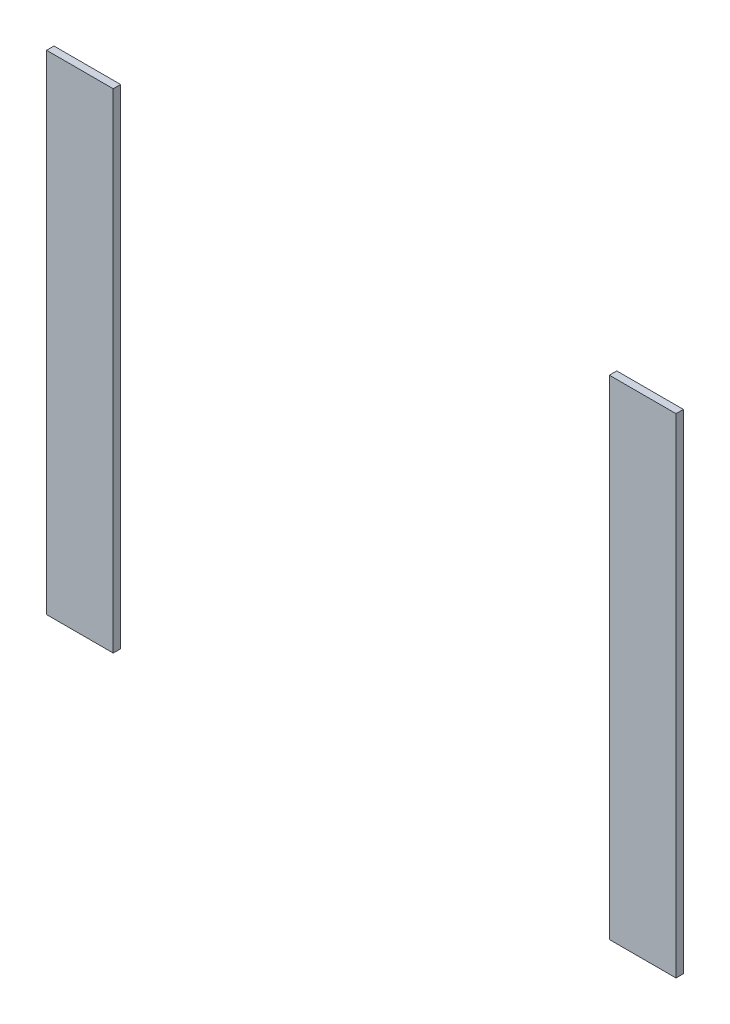
ISO-10303-21;
HEADER;
FILE_DESCRIPTION(('STEP AP214'),'2;1');
FILE_NAME('part.step','',(''),(''),'','','');
FILE_SCHEMA(('AUTOMOTIVE_DESIGN { 1 0 10303 214 1 1 1 1 }'));
ENDSEC;
DATA;
#1=APPLICATION_CONTEXT('core data for automotive mechanical design processes');
#2=APPLICATION_PROTOCOL_DEFINITION('international standard','automotive_design',2000,#1);
#3=PRODUCT_CONTEXT('',#1,'mechanical');
#4=PRODUCT('Part','Part','',(#3));
#5=PRODUCT_RELATED_PRODUCT_CATEGORY('part','',(#4));
#6=PRODUCT_DEFINITION_FORMATION('','',#4);
#7=PRODUCT_DEFINITION_CONTEXT('part definition',#1,'design');
#8=PRODUCT_DEFINITION('design','',#6,#7);
#9=PRODUCT_DEFINITION_SHAPE('','',#8);
#10=(LENGTH_UNIT() NAMED_UNIT(*) SI_UNIT(.MILLI.,.METRE.));
#11=(NAMED_UNIT(*) PLANE_ANGLE_UNIT() SI_UNIT($,.RADIAN.));
#12=(NAMED_UNIT(*) SI_UNIT($,.STERADIAN.) SOLID_ANGLE_UNIT());
#13=UNCERTAINTY_MEASURE_WITH_UNIT(LENGTH_MEASURE(1.E-05),#10,'distance_accuracy_value','');
#14=(GEOMETRIC_REPRESENTATION_CONTEXT(3) GLOBAL_UNCERTAINTY_ASSIGNED_CONTEXT((#13)) GLOBAL_UNIT_ASSIGNED_CONTEXT((#10,
#11,#12)) REPRESENTATION_CONTEXT('',''));
#15=CARTESIAN_POINT('',(0.,0.,0.));
#16=DIRECTION('',(0.,0.,1.));
#17=DIRECTION('',(1.,0.,0.));
#18=AXIS2_PLACEMENT_3D('',#15,#16,#17);
#19=CARTESIAN_POINT('',(335.000000000001,0.,10.));
#20=DIRECTION('',(-1.,0.,0.));
#21=DIRECTION('',(0.,0.,1.));
#22=AXIS2_PLACEMENT_3D('',#19,#20,#21);
#23=PLANE('',#22);
#24=DIRECTION('',(0.,1.,0.));
#25=VECTOR('',#24,1.);
#26=CARTESIAN_POINT('',(335.000000000001,0.,0.));
#27=LINE('',#26,#25);
#28=CARTESIAN_POINT('',(335.000000000001,-45.,0.));
#29=VERTEX_POINT('',#28);
#30=CARTESIAN_POINT('',(335.000000000001,615.,0.));
#31=VERTEX_POINT('',#30);
#32=EDGE_CURVE('E109',#29,#31,#27,.T.);
#33=ORIENTED_EDGE('',*,*,#32,.F.);
#34=DIRECTION('',(0.,0.,-1.));
#35=VECTOR('',#34,1.);
#36=CARTESIAN_POINT('',(335.000000000001,-45.,10.));
#37=LINE('',#36,#35);
#38=CARTESIAN_POINT('',(335.000000000001,-45.,10.));
#39=VERTEX_POINT('',#38);
#40=EDGE_CURVE('E12',#39,#29,#37,.T.);
#41=ORIENTED_EDGE('',*,*,#40,.F.);
#42=DIRECTION('',(0.,1.,0.));
#43=VECTOR('',#42,1.);
#44=CARTESIAN_POINT('',(335.000000000001,0.,10.));
#45=LINE('',#44,#43);
#46=CARTESIAN_POINT('',(335.000000000001,615.,10.));
#47=VERTEX_POINT('',#46);
#48=EDGE_CURVE('E103',#39,#47,#45,.T.);
#49=ORIENTED_EDGE('',*,*,#48,.T.);
#50=DIRECTION('',(0.,0.,-1.));
#51=VECTOR('',#50,1.);
#52=CARTESIAN_POINT('',(335.000000000001,615.,10.));
#53=LINE('',#52,#51);
#54=EDGE_CURVE('E61',#47,#31,#53,.T.);
#55=ORIENTED_EDGE('',*,*,#54,.T.);
#56=EDGE_LOOP('',(#33,#41,#49,#55));
#57=FACE_BOUND('',#56,.T.);
#58=ADVANCED_FACE('F45',(#57),#23,.T.);
#59=CARTESIAN_POINT('',(0.,-45.0000000000001,10.));
#60=DIRECTION('',(0.,-1.,0.));
#61=DIRECTION('',(1.,0.,0.));
#62=AXIS2_PLACEMENT_3D('',#59,#60,#61);
#63=PLANE('',#62);
#64=DIRECTION('',(-1.,0.,0.));
#65=VECTOR('',#64,1.);
#66=CARTESIAN_POINT('',(0.,-45.0000000000001,0.));
#67=LINE('',#66,#65);
#68=CARTESIAN_POINT('',(425.000000000001,-45.,0.));
#69=VERTEX_POINT('',#68);
#70=EDGE_CURVE('E93',#69,#29,#67,.T.);
#71=ORIENTED_EDGE('',*,*,#70,.F.);
#72=DIRECTION('',(0.,0.,-1.));
#73=VECTOR('',#72,1.);
#74=CARTESIAN_POINT('',(425.000000000001,-45.,10.));
#75=LINE('',#74,#73);
#76=CARTESIAN_POINT('',(425.000000000001,-45.,10.));
#77=VERTEX_POINT('',#76);
#78=EDGE_CURVE('E53',#77,#69,#75,.T.);
#79=ORIENTED_EDGE('',*,*,#78,.F.);
#80=DIRECTION('',(-1.,0.,0.));
#81=VECTOR('',#80,1.);
#82=CARTESIAN_POINT('',(0.,-45.0000000000001,10.));
#83=LINE('',#82,#81);
#84=EDGE_CURVE('E91',#77,#39,#83,.T.);
#85=ORIENTED_EDGE('',*,*,#84,.T.);
#86=ORIENTED_EDGE('',*,*,#40,.T.);
#87=EDGE_LOOP('',(#71,#79,#85,#86));
#88=FACE_BOUND('',#87,.T.);
#89=ADVANCED_FACE('F89',(#88),#63,.T.);
#90=CARTESIAN_POINT('',(425.000000000001,0.,10.));
#91=DIRECTION('',(-1.,0.,0.));
#92=DIRECTION('',(0.,0.,1.));
#93=AXIS2_PLACEMENT_3D('',#90,#91,#92);
#94=PLANE('',#93);
#95=DIRECTION('',(0.,1.,0.));
#96=VECTOR('',#95,1.);
#97=CARTESIAN_POINT('',(425.000000000001,0.,0.));
#98=LINE('',#97,#96);
#99=CARTESIAN_POINT('',(425.000000000001,615.,0.));
#100=VERTEX_POINT('',#99);
#101=EDGE_CURVE('E112',#69,#100,#98,.T.);
#102=ORIENTED_EDGE('',*,*,#101,.T.);
#103=DIRECTION('',(0.,0.,-1.));
#104=VECTOR('',#103,1.);
#105=CARTESIAN_POINT('',(425.000000000001,615.,10.));
#106=LINE('',#105,#104);
#107=CARTESIAN_POINT('',(425.000000000001,615.,10.));
#108=VERTEX_POINT('',#107);
#109=EDGE_CURVE('E75',#108,#100,#106,.T.);
#110=ORIENTED_EDGE('',*,*,#109,.F.);
#111=DIRECTION('',(0.,1.,0.));
#112=VECTOR('',#111,1.);
#113=CARTESIAN_POINT('',(425.000000000001,0.,10.));
#114=LINE('',#113,#112);
#115=EDGE_CURVE('E96',#77,#108,#114,.T.);
#116=ORIENTED_EDGE('',*,*,#115,.F.);
#117=ORIENTED_EDGE('',*,*,#78,.T.);
#118=EDGE_LOOP('',(#102,#110,#116,#117));
#119=FACE_BOUND('',#118,.T.);
#120=ADVANCED_FACE('F97',(#119),#94,.F.);
#121=CARTESIAN_POINT('',(0.,615.,10.));
#122=DIRECTION('',(0.,1.,0.));
#123=DIRECTION('',(0.,0.,1.));
#124=AXIS2_PLACEMENT_3D('',#121,#122,#123);
#125=PLANE('',#124);
#126=DIRECTION('',(1.,0.,0.));
#127=VECTOR('',#126,1.);
#128=CARTESIAN_POINT('',(0.,615.,0.));
#129=LINE('',#128,#127);
#130=EDGE_CURVE('E105',#31,#100,#129,.T.);
#131=ORIENTED_EDGE('',*,*,#130,.F.);
#132=ORIENTED_EDGE('',*,*,#54,.F.);
#133=DIRECTION('',(1.,0.,0.));
#134=VECTOR('',#133,1.);
#135=CARTESIAN_POINT('',(0.,615.,10.));
#136=LINE('',#135,#134);
#137=EDGE_CURVE('E100',#47,#108,#136,.T.);
#138=ORIENTED_EDGE('',*,*,#137,.T.);
#139=ORIENTED_EDGE('',*,*,#109,.T.);
#140=EDGE_LOOP('',(#131,#132,#138,#139));
#141=FACE_BOUND('',#140,.T.);
#142=ADVANCED_FACE('F119',(#141),#125,.T.);
#143=CARTESIAN_POINT('',(0.,0.,10.));
#144=DIRECTION('',(0.,0.,1.));
#145=DIRECTION('',(1.,0.,0.));
#146=AXIS2_PLACEMENT_3D('',#143,#144,#145);
#147=PLANE('',#146);
#148=ORIENTED_EDGE('',*,*,#48,.F.);
#149=ORIENTED_EDGE('',*,*,#84,.F.);
#150=ORIENTED_EDGE('',*,*,#115,.T.);
#151=ORIENTED_EDGE('',*,*,#137,.F.);
#152=EDGE_LOOP('',(#148,#149,#150,#151));
#153=FACE_BOUND('',#152,.T.);
#154=ADVANCED_FACE('F102',(#153),#147,.T.);
#155=CARTESIAN_POINT('',(0.,0.,0.));
#156=DIRECTION('',(0.,0.,1.));
#157=DIRECTION('',(1.,0.,0.));
#158=AXIS2_PLACEMENT_3D('',#155,#156,#157);
#159=PLANE('',#158);
#160=ORIENTED_EDGE('',*,*,#32,.T.);
#161=ORIENTED_EDGE('',*,*,#130,.T.);
#162=ORIENTED_EDGE('',*,*,#101,.F.);
#163=ORIENTED_EDGE('',*,*,#70,.T.);
#164=EDGE_LOOP('',(#160,#161,#162,#163));
#165=FACE_BOUND('',#164,.T.);
#166=ADVANCED_FACE('F118',(#165),#159,.F.);
#167=CLOSED_SHELL('',(#58,#89,#120,#142,#154,#166));
#168=MANIFOLD_SOLID_BREP('B2',#167);
#169=CARTESIAN_POINT('',(0.,-45.,10.));
#170=DIRECTION('',(0.,1.,0.));
#171=DIRECTION('',(0.,0.,1.));
#172=AXIS2_PLACEMENT_3D('',#169,#170,#171);
#173=PLANE('',#172);
#174=DIRECTION('',(1.,0.,0.));
#175=VECTOR('',#174,1.);
#176=CARTESIAN_POINT('',(0.,-45.,0.));
#177=LINE('',#176,#175);
#178=CARTESIAN_POINT('',(-424.999999999999,-45.,0.));
#179=VERTEX_POINT('',#178);
#180=CARTESIAN_POINT('',(-334.999999999999,-45.,0.));
#181=VERTEX_POINT('',#180);
#182=EDGE_CURVE('E235',#179,#181,#177,.T.);
#183=ORIENTED_EDGE('',*,*,#182,.T.);
#184=DIRECTION('',(0.,0.,-1.));
#185=VECTOR('',#184,1.);
#186=CARTESIAN_POINT('',(-334.999999999999,-45.,10.));
#187=LINE('',#186,#185);
#188=CARTESIAN_POINT('',(-334.999999999999,-45.,10.));
#189=VERTEX_POINT('',#188);
#190=EDGE_CURVE('E43',#189,#181,#187,.T.);
#191=ORIENTED_EDGE('',*,*,#190,.F.);
#192=DIRECTION('',(1.,0.,0.));
#193=VECTOR('',#192,1.);
#194=CARTESIAN_POINT('',(0.,-45.,10.));
#195=LINE('',#194,#193);
#196=CARTESIAN_POINT('',(-424.999999999999,-45.,10.));
#197=VERTEX_POINT('',#196);
#198=EDGE_CURVE('E221',#197,#189,#195,.T.);
#199=ORIENTED_EDGE('',*,*,#198,.F.);
#200=DIRECTION('',(0.,0.,-1.));
#201=VECTOR('',#200,1.);
#202=CARTESIAN_POINT('',(-424.999999999999,-45.,10.));
#203=LINE('',#202,#201);
#204=EDGE_CURVE('E188',#197,#179,#203,.T.);
#205=ORIENTED_EDGE('',*,*,#204,.T.);
#206=EDGE_LOOP('',(#183,#191,#199,#205));
#207=FACE_BOUND('',#206,.T.);
#208=ADVANCED_FACE('F172',(#207),#173,.F.);
#209=CARTESIAN_POINT('',(-334.999999999999,0.,10.));
#210=DIRECTION('',(-1.,0.,0.));
#211=DIRECTION('',(0.,0.,1.));
#212=AXIS2_PLACEMENT_3D('',#209,#210,#211);
#213=PLANE('',#212);
#214=DIRECTION('',(0.,1.,0.));
#215=VECTOR('',#214,1.);
#216=CARTESIAN_POINT('',(-334.999999999999,0.,0.));
#217=LINE('',#216,#215);
#218=CARTESIAN_POINT('',(-334.999999999999,615.,0.));
#219=VERTEX_POINT('',#218);
#220=EDGE_CURVE('E226',#181,#219,#217,.T.);
#221=ORIENTED_EDGE('',*,*,#220,.T.);
#222=DIRECTION('',(0.,0.,-1.));
#223=VECTOR('',#222,1.);
#224=CARTESIAN_POINT('',(-334.999999999999,615.,10.));
#225=LINE('',#224,#223);
#226=CARTESIAN_POINT('',(-334.999999999999,615.,10.));
#227=VERTEX_POINT('',#226);
#228=EDGE_CURVE('E180',#227,#219,#225,.T.);
#229=ORIENTED_EDGE('',*,*,#228,.F.);
#230=DIRECTION('',(0.,1.,0.));
#231=VECTOR('',#230,1.);
#232=CARTESIAN_POINT('',(-334.999999999999,0.,10.));
#233=LINE('',#232,#231);
#234=EDGE_CURVE('E213',#189,#227,#233,.T.);
#235=ORIENTED_EDGE('',*,*,#234,.F.);
#236=ORIENTED_EDGE('',*,*,#190,.T.);
#237=EDGE_LOOP('',(#221,#229,#235,#236));
#238=FACE_BOUND('',#237,.T.);
#239=ADVANCED_FACE('F225',(#238),#213,.F.);
#240=CARTESIAN_POINT('',(0.,615.,10.));
#241=DIRECTION('',(0.,1.,0.));
#242=DIRECTION('',(0.,0.,1.));
#243=AXIS2_PLACEMENT_3D('',#240,#241,#242);
#244=PLANE('',#243);
#245=DIRECTION('',(1.,0.,0.));
#246=VECTOR('',#245,1.);
#247=CARTESIAN_POINT('',(0.,615.,0.));
#248=LINE('',#247,#246);
#249=CARTESIAN_POINT('',(-424.999999999999,615.,0.));
#250=VERTEX_POINT('',#249);
#251=EDGE_CURVE('E238',#250,#219,#248,.T.);
#252=ORIENTED_EDGE('',*,*,#251,.F.);
#253=DIRECTION('',(0.,0.,-1.));
#254=VECTOR('',#253,1.);
#255=CARTESIAN_POINT('',(-424.999999999999,615.,10.));
#256=LINE('',#255,#254);
#257=CARTESIAN_POINT('',(-424.999999999999,615.,10.));
#258=VERTEX_POINT('',#257);
#259=EDGE_CURVE('E202',#258,#250,#256,.T.);
#260=ORIENTED_EDGE('',*,*,#259,.F.);
#261=DIRECTION('',(1.,0.,0.));
#262=VECTOR('',#261,1.);
#263=CARTESIAN_POINT('',(0.,615.,10.));
#264=LINE('',#263,#262);
#265=EDGE_CURVE('E220',#258,#227,#264,.T.);
#266=ORIENTED_EDGE('',*,*,#265,.T.);
#267=ORIENTED_EDGE('',*,*,#228,.T.);
#268=EDGE_LOOP('',(#252,#260,#266,#267));
#269=FACE_BOUND('',#268,.T.);
#270=ADVANCED_FACE('F229',(#269),#244,.T.);
#271=CARTESIAN_POINT('',(-424.999999999999,0.,10.));
#272=DIRECTION('',(-1.,0.,0.));
#273=DIRECTION('',(0.,0.,1.));
#274=AXIS2_PLACEMENT_3D('',#271,#272,#273);
#275=PLANE('',#274);
#276=DIRECTION('',(0.,1.,0.));
#277=VECTOR('',#276,1.);
#278=CARTESIAN_POINT('',(-424.999999999999,0.,0.));
#279=LINE('',#278,#277);
#280=EDGE_CURVE('E240',#179,#250,#279,.T.);
#281=ORIENTED_EDGE('',*,*,#280,.F.);
#282=ORIENTED_EDGE('',*,*,#204,.F.);
#283=DIRECTION('',(0.,1.,0.));
#284=VECTOR('',#283,1.);
#285=CARTESIAN_POINT('',(-424.999999999999,0.,10.));
#286=LINE('',#285,#284);
#287=EDGE_CURVE('E230',#197,#258,#286,.T.);
#288=ORIENTED_EDGE('',*,*,#287,.T.);
#289=ORIENTED_EDGE('',*,*,#259,.T.);
#290=EDGE_LOOP('',(#281,#282,#288,#289));
#291=FACE_BOUND('',#290,.T.);
#292=ADVANCED_FACE('F246',(#291),#275,.T.);
#293=CARTESIAN_POINT('',(0.,0.,10.));
#294=DIRECTION('',(0.,0.,1.));
#295=DIRECTION('',(1.,0.,0.));
#296=AXIS2_PLACEMENT_3D('',#293,#294,#295);
#297=PLANE('',#296);
#298=ORIENTED_EDGE('',*,*,#198,.T.);
#299=ORIENTED_EDGE('',*,*,#234,.T.);
#300=ORIENTED_EDGE('',*,*,#265,.F.);
#301=ORIENTED_EDGE('',*,*,#287,.F.);
#302=EDGE_LOOP('',(#298,#299,#300,#301));
#303=FACE_BOUND('',#302,.T.);
#304=ADVANCED_FACE('F217',(#303),#297,.T.);
#305=CARTESIAN_POINT('',(0.,0.,0.));
#306=DIRECTION('',(0.,0.,1.));
#307=DIRECTION('',(1.,0.,0.));
#308=AXIS2_PLACEMENT_3D('',#305,#306,#307);
#309=PLANE('',#308);
#310=ORIENTED_EDGE('',*,*,#182,.F.);
#311=ORIENTED_EDGE('',*,*,#280,.T.);
#312=ORIENTED_EDGE('',*,*,#251,.T.);
#313=ORIENTED_EDGE('',*,*,#220,.F.);
#314=EDGE_LOOP('',(#310,#311,#312,#313));
#315=FACE_BOUND('',#314,.T.);
#316=ADVANCED_FACE('F245',(#315),#309,.F.);
#317=CLOSED_SHELL('',(#208,#239,#270,#292,#304,#316));
#318=MANIFOLD_SOLID_BREP('B6',#317);
#319=ADVANCED_BREP_SHAPE_REPRESENTATION('',(#18,#168,#318),#14);
#320=SHAPE_DEFINITION_REPRESENTATION(#9,#319);
ENDSEC;
END-ISO-10303-21;
